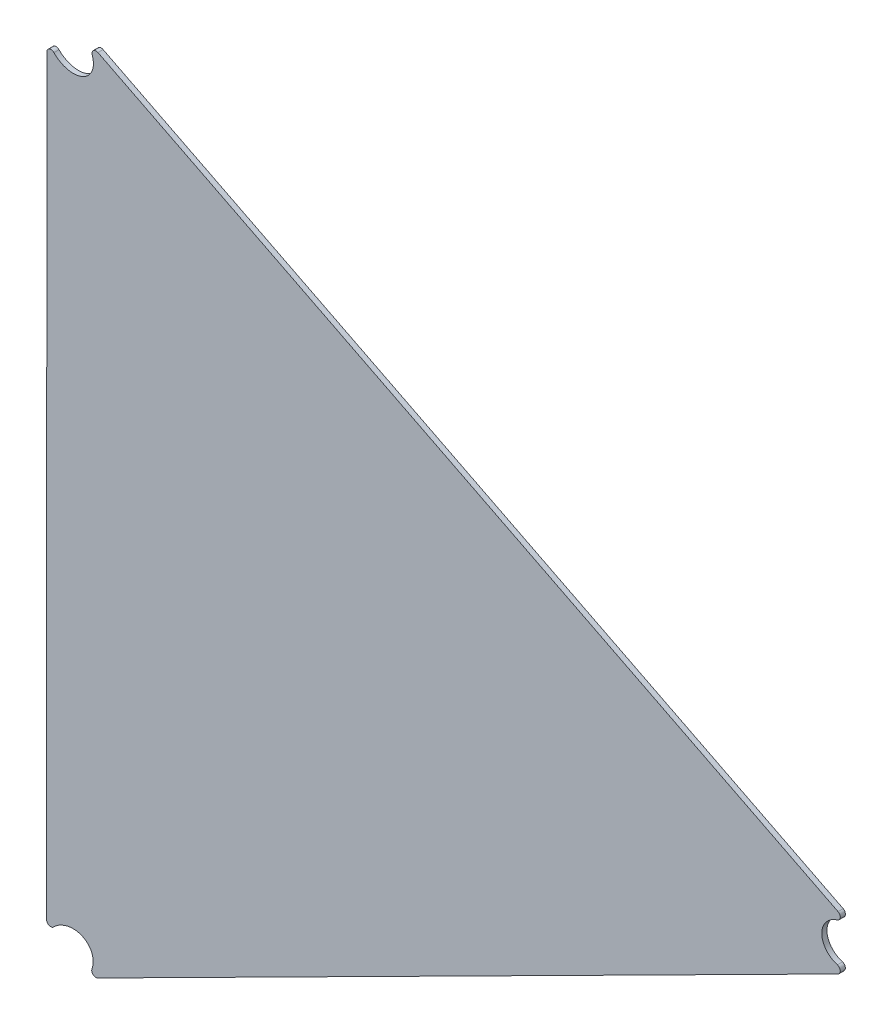
ISO-10303-21;
HEADER;
FILE_DESCRIPTION(('STEP AP214'),'2;1');
FILE_NAME('part.step','',(''),(''),'','','');
FILE_SCHEMA(('AUTOMOTIVE_DESIGN { 1 0 10303 214 1 1 1 1 }'));
ENDSEC;
DATA;
#1=APPLICATION_CONTEXT('core data for automotive mechanical design processes');
#2=APPLICATION_PROTOCOL_DEFINITION('international standard','automotive_design',2000,#1);
#3=PRODUCT_CONTEXT('',#1,'mechanical');
#4=PRODUCT('Part','Part','',(#3));
#5=PRODUCT_RELATED_PRODUCT_CATEGORY('part','',(#4));
#6=PRODUCT_DEFINITION_FORMATION('','',#4);
#7=PRODUCT_DEFINITION_CONTEXT('part definition',#1,'design');
#8=PRODUCT_DEFINITION('design','',#6,#7);
#9=PRODUCT_DEFINITION_SHAPE('','',#8);
#10=(LENGTH_UNIT() NAMED_UNIT(*) SI_UNIT(.MILLI.,.METRE.));
#11=(NAMED_UNIT(*) PLANE_ANGLE_UNIT() SI_UNIT($,.RADIAN.));
#12=(NAMED_UNIT(*) SI_UNIT($,.STERADIAN.) SOLID_ANGLE_UNIT());
#13=UNCERTAINTY_MEASURE_WITH_UNIT(LENGTH_MEASURE(1.E-05),#10,'distance_accuracy_value','');
#14=(GEOMETRIC_REPRESENTATION_CONTEXT(3) GLOBAL_UNCERTAINTY_ASSIGNED_CONTEXT((#13)) GLOBAL_UNIT_ASSIGNED_CONTEXT((#10,
#11,#12)) REPRESENTATION_CONTEXT('',''));
#15=CARTESIAN_POINT('',(0.,0.,0.));
#16=DIRECTION('',(0.,0.,1.));
#17=DIRECTION('',(1.,0.,0.));
#18=AXIS2_PLACEMENT_3D('',#15,#16,#17);
#19=CARTESIAN_POINT('',(58.7659431933585,116.31081468342,3.175));
#20=DIRECTION('',(0.450957770189797,0.89254528708937,0.));
#21=DIRECTION('',(-0.89254528708937,0.450957770189797,0.));
#22=AXIS2_PLACEMENT_3D('',#19,#20,#21);
#23=PLANE('',#22);
#24=DIRECTION('',(0.89254528708937,-0.450957770189797,0.));
#25=VECTOR('',#24,1.);
#26=CARTESIAN_POINT('',(58.7659431933585,116.31081468342,0.));
#27=LINE('',#26,#25);
#28=CARTESIAN_POINT('',(-216.125289866631,255.199383474937,0.));
#29=VERTEX_POINT('',#28);
#30=CARTESIAN_POINT('',(241.670605569378,23.898384865561,0.));
#31=VERTEX_POINT('',#30);
#32=EDGE_CURVE('E167',#29,#31,#27,.T.);
#33=ORIENTED_EDGE('',*,*,#32,.F.);
#34=DIRECTION('',(0.,0.,1.));
#35=VECTOR('',#34,1.);
#36=CARTESIAN_POINT('',(-216.125289866631,255.199383474937,3.175));
#37=LINE('',#36,#35);
#38=CARTESIAN_POINT('',(-216.125289866631,255.199383474937,3.175));
#39=VERTEX_POINT('',#38);
#40=EDGE_CURVE('E214',#29,#39,#37,.T.);
#41=ORIENTED_EDGE('',*,*,#40,.T.);
#42=DIRECTION('',(0.89254528708937,-0.450957770189797,0.));
#43=VECTOR('',#42,1.);
#44=CARTESIAN_POINT('',(58.7659431933585,116.31081468342,3.175));
#45=LINE('',#44,#43);
#46=CARTESIAN_POINT('',(241.670605569378,23.898384865561,3.175));
#47=VERTEX_POINT('',#46);
#48=EDGE_CURVE('E184',#39,#47,#45,.T.);
#49=ORIENTED_EDGE('',*,*,#48,.T.);
#50=DIRECTION('',(0.,0.,1.));
#51=VECTOR('',#50,1.);
#52=CARTESIAN_POINT('',(241.670605569378,23.8983848655609,0.));
#53=LINE('',#52,#51);
#54=EDGE_CURVE('E211',#47,#31,#53,.F.);
#55=ORIENTED_EDGE('',*,*,#54,.T.);
#56=EDGE_LOOP('',(#33,#41,#49,#55));
#57=FACE_BOUND('',#56,.T.);
#58=ADVANCED_FACE('F44',(#57),#23,.T.);
#59=CARTESIAN_POINT('',(-220.367085382762,242.285684548812,3.175));
#60=CARTESIAN_POINT('',(-232.922317899601,220.205690516927,3.175));
#61=CARTESIAN_POINT('',(-258.843580849406,234.945163860758,3.175));
#62=CARTESIAN_POINT('',(-246.288348332567,257.025157892643,3.175));
#63=CARTESIAN_POINT('',(-233.733115815727,279.105151924529,3.175));
#64=CARTESIAN_POINT('',(-207.811852865923,264.365678580698,3.175));
#65=CARTESIAN_POINT('',(-220.367085382762,242.285684548812,3.175));
#66=(BOUNDED_CURVE() B_SPLINE_CURVE(3,(#59,#60,#61,#62,#63,#64,#65),.UNSPECIFIED.,.T.,
.F.) B_SPLINE_CURVE_WITH_KNOTS((4,3,4),(0.,0.5,1.),
.UNSPECIFIED.) CURVE() GEOMETRIC_REPRESENTATION_ITEM() RATIONAL_B_SPLINE_CURVE((1.,
0.333333333333333,0.333333333333333,1.,0.333333333333333,0.333333333333333,1.)) REPRESENTATION_ITEM(''));
#67=DIRECTION('',(0.,0.,-1.));
#68=VECTOR('',#67,1.);
#69=SURFACE_OF_LINEAR_EXTRUSION('',#66,#68);
#70=CARTESIAN_POINT('',(-220.367085382762,242.285684548812,0.));
#71=CARTESIAN_POINT('',(-232.922317899601,220.205690516927,0.));
#72=CARTESIAN_POINT('',(-258.843580849406,234.945163860758,0.));
#73=CARTESIAN_POINT('',(-246.288348332567,257.025157892643,0.));
#74=CARTESIAN_POINT('',(-233.733115815727,279.105151924529,0.));
#75=CARTESIAN_POINT('',(-207.811852865923,264.365678580698,0.));
#76=CARTESIAN_POINT('',(-220.367085382762,242.285684548812,0.));
#77=(BOUNDED_CURVE() B_SPLINE_CURVE(3,(#70,#71,#72,#73,#74,#75,#76),.UNSPECIFIED.,.T.,
.F.) B_SPLINE_CURVE_WITH_KNOTS((4,3,4),(0.,0.5,1.),
.UNSPECIFIED.) CURVE() GEOMETRIC_REPRESENTATION_ITEM() RATIONAL_B_SPLINE_CURVE((1.,
0.333333333333333,0.333333333333333,1.,0.333333333333333,0.333333333333333,1.)) REPRESENTATION_ITEM(''));
#78=CARTESIAN_POINT('',(-219.668408896516,252.094046152578,0.));
#79=VERTEX_POINT('',#78);
#80=CARTESIAN_POINT('',(-243.381643144723,241.512419940637,0.));
#81=VERTEX_POINT('',#80);
#82=EDGE_CURVE('E162',#79,#81,#77,.T.);
#83=ORIENTED_EDGE('',*,*,#82,.T.);
#84=DIRECTION('',(0.,0.,-1.));
#85=VECTOR('',#84,1.);
#86=CARTESIAN_POINT('',(-243.381643144723,241.512419940637,0.));
#87=LINE('',#86,#85);
#88=CARTESIAN_POINT('',(-243.381643144723,241.512419940637,3.175));
#89=VERTEX_POINT('',#88);
#90=EDGE_CURVE('E139',#81,#89,#87,.F.);
#91=ORIENTED_EDGE('',*,*,#90,.T.);
#92=CARTESIAN_POINT('',(-219.668408896516,252.094046152578,3.175));
#93=VERTEX_POINT('',#92);
#94=EDGE_CURVE('E278',#93,#89,#66,.T.);
#95=ORIENTED_EDGE('',*,*,#94,.F.);
#96=DIRECTION('',(0.,0.,-1.));
#97=VECTOR('',#96,1.);
#98=CARTESIAN_POINT('',(-219.668408896516,252.094046152578,3.175));
#99=LINE('',#98,#97);
#100=EDGE_CURVE('E144',#93,#79,#99,.T.);
#101=ORIENTED_EDGE('',*,*,#100,.T.);
#102=EDGE_LOOP('',(#83,#91,#95,#101));
#103=FACE_BOUND('',#102,.T.);
#104=ADVANCED_FACE('F286',(#103),#69,.F.);
#105=CARTESIAN_POINT('',(-247.811547389579,0.0817305887019815,3.175));
#106=DIRECTION('',(0.99999994561287,-0.000329809426226626,0.));
#107=DIRECTION('',(0.000329809426226626,0.99999994561287,0.));
#108=AXIS2_PLACEMENT_3D('',#105,#106,#107);
#109=PLANE('',#108);
#110=DIRECTION('',(-0.000329809426226626,-0.99999994561287,0.));
#111=VECTOR('',#110,1.);
#112=CARTESIAN_POINT('',(-247.811547389579,0.0817305887019815,3.175));
#113=LINE('',#112,#111);
#114=CARTESIAN_POINT('',(-247.732508419993,239.732143832451,3.175));
#115=VERTEX_POINT('',#114);
#116=CARTESIAN_POINT('',(-247.885839538062,-225.176065382714,3.175));
#117=VERTEX_POINT('',#116);
#118=EDGE_CURVE('E154',#115,#117,#113,.T.);
#119=ORIENTED_EDGE('',*,*,#118,.F.);
#120=DIRECTION('',(0.,0.,-1.));
#121=VECTOR('',#120,1.);
#122=CARTESIAN_POINT('',(-247.732508419993,239.732143832451,3.175));
#123=LINE('',#122,#121);
#124=CARTESIAN_POINT('',(-247.732508419993,239.732143832451,0.));
#125=VERTEX_POINT('',#124);
#126=EDGE_CURVE('E138',#115,#125,#123,.T.);
#127=ORIENTED_EDGE('',*,*,#126,.T.);
#128=DIRECTION('',(-0.000329809426226626,-0.99999994561287,0.));
#129=VECTOR('',#128,1.);
#130=CARTESIAN_POINT('',(-247.811547389579,0.0817305887019815,0.));
#131=LINE('',#130,#129);
#132=CARTESIAN_POINT('',(-247.885839538062,-225.176065382714,0.));
#133=VERTEX_POINT('',#132);
#134=EDGE_CURVE('E151',#125,#133,#131,.T.);
#135=ORIENTED_EDGE('',*,*,#134,.T.);
#136=DIRECTION('',(0.,0.,-1.));
#137=VECTOR('',#136,1.);
#138=CARTESIAN_POINT('',(-247.885839538062,-225.176065382713,3.175));
#139=LINE('',#138,#137);
#140=EDGE_CURVE('E156',#133,#117,#139,.F.);
#141=ORIENTED_EDGE('',*,*,#140,.T.);
#142=EDGE_LOOP('',(#119,#127,#135,#141));
#143=FACE_BOUND('',#142,.T.);
#144=ADVANCED_FACE('F150',(#143),#109,.F.);
#145=CARTESIAN_POINT('',(-220.525871765348,-227.74584753326,3.175));
#146=CARTESIAN_POINT('',(-207.980114588808,-249.831226788942,3.175));
#147=CARTESIAN_POINT('',(-233.905964880208,-264.558590923635,3.175));
#148=CARTESIAN_POINT('',(-246.451722056748,-242.473211667953,3.175));
#149=CARTESIAN_POINT('',(-258.997479233288,-220.387832412272,3.175));
#150=CARTESIAN_POINT('',(-233.071628941887,-205.660468277578,3.175));
#151=CARTESIAN_POINT('',(-220.525871765348,-227.74584753326,3.175));
#152=(BOUNDED_CURVE() B_SPLINE_CURVE(3,(#145,#146,#147,#148,#149,#150,#151),.UNSPECIFIED.,.T.,
.F.) B_SPLINE_CURVE_WITH_KNOTS((4,3,4),(0.,0.5,1.),
.UNSPECIFIED.) CURVE() GEOMETRIC_REPRESENTATION_ITEM() RATIONAL_B_SPLINE_CURVE((1.,
0.333333333333333,0.333333333333333,1.,0.333333333333333,0.333333333333333,1.)) REPRESENTATION_ITEM(''));
#153=DIRECTION('',(0.,0.,-1.));
#154=VECTOR('',#153,1.);
#155=SURFACE_OF_LINEAR_EXTRUSION('',#152,#154);
#156=CARTESIAN_POINT('',(-220.525871765348,-227.74584753326,0.));
#157=CARTESIAN_POINT('',(-207.980114588808,-249.831226788942,0.));
#158=CARTESIAN_POINT('',(-233.905964880208,-264.558590923635,0.));
#159=CARTESIAN_POINT('',(-246.451722056748,-242.473211667953,0.));
#160=CARTESIAN_POINT('',(-258.997479233288,-220.387832412272,0.));
#161=CARTESIAN_POINT('',(-233.071628941887,-205.660468277578,0.));
#162=CARTESIAN_POINT('',(-220.525871765348,-227.74584753326,0.));
#163=(BOUNDED_CURVE() B_SPLINE_CURVE(3,(#156,#157,#158,#159,#160,#161,#162),.UNSPECIFIED.,.T.,
.F.) B_SPLINE_CURVE_WITH_KNOTS((4,3,4),(0.,0.5,1.),
.UNSPECIFIED.) CURVE() GEOMETRIC_REPRESENTATION_ITEM() RATIONAL_B_SPLINE_CURVE((1.,
0.333333333333333,0.333333333333333,1.,0.333333333333333,0.333333333333333,1.)) REPRESENTATION_ITEM(''));
#164=CARTESIAN_POINT('',(-243.536134041832,-226.95919530728,0.));
#165=VERTEX_POINT('',#164);
#166=CARTESIAN_POINT('',(-219.831184056302,-237.554444482021,0.));
#167=VERTEX_POINT('',#166);
#168=EDGE_CURVE('E161',#165,#167,#163,.T.);
#169=ORIENTED_EDGE('',*,*,#168,.T.);
#170=DIRECTION('',(0.,0.,-1.));
#171=VECTOR('',#170,1.);
#172=CARTESIAN_POINT('',(-219.831184056302,-237.554444482021,0.));
#173=LINE('',#172,#171);
#174=CARTESIAN_POINT('',(-219.831184056302,-237.554444482021,3.175));
#175=VERTEX_POINT('',#174);
#176=EDGE_CURVE('E224',#167,#175,#173,.F.);
#177=ORIENTED_EDGE('',*,*,#176,.T.);
#178=CARTESIAN_POINT('',(-243.536134041832,-226.95919530728,3.175));
#179=VERTEX_POINT('',#178);
#180=EDGE_CURVE('E230',#179,#175,#152,.T.);
#181=ORIENTED_EDGE('',*,*,#180,.F.);
#182=DIRECTION('',(0.,0.,-1.));
#183=VECTOR('',#182,1.);
#184=CARTESIAN_POINT('',(-243.536134041832,-226.95919530728,3.175));
#185=LINE('',#184,#183);
#186=EDGE_CURVE('E221',#179,#165,#185,.T.);
#187=ORIENTED_EDGE('',*,*,#186,.T.);
#188=EDGE_LOOP('',(#169,#177,#181,#187));
#189=FACE_BOUND('',#188,.T.);
#190=ADVANCED_FACE('F229',(#189),#155,.F.);
#191=CARTESIAN_POINT('',(52.8944621775781,-104.80247024521,3.175));
#192=DIRECTION('',(-0.450571607871069,0.892740290443127,0.));
#193=DIRECTION('',(-0.892740290443127,-0.45057160787107,0.));
#194=AXIS2_PLACEMENT_3D('',#191,#192,#193);
#195=PLANE('',#194);
#196=DIRECTION('',(0.892740290443127,0.45057160787107,0.));
#197=VECTOR('',#196,1.);
#198=CARTESIAN_POINT('',(52.8944621775781,-104.80247024521,3.175));
#199=LINE('',#198,#197);
#200=CARTESIAN_POINT('',(-216.289382854834,-240.661240334961,3.175));
#201=VERTEX_POINT('',#200);
#202=CARTESIAN_POINT('',(241.661178158875,-9.53072812408658,3.175));
#203=VERTEX_POINT('',#202);
#204=EDGE_CURVE('E238',#201,#203,#199,.T.);
#205=ORIENTED_EDGE('',*,*,#204,.F.);
#206=DIRECTION('',(0.,0.,-1.));
#207=VECTOR('',#206,1.);
#208=CARTESIAN_POINT('',(-216.289382854834,-240.661240334961,3.175));
#209=LINE('',#208,#207);
#210=CARTESIAN_POINT('',(-216.289382854834,-240.661240334961,0.));
#211=VERTEX_POINT('',#210);
#212=EDGE_CURVE('E218',#201,#211,#209,.T.);
#213=ORIENTED_EDGE('',*,*,#212,.T.);
#214=DIRECTION('',(0.892740290443127,0.45057160787107,0.));
#215=VECTOR('',#214,1.);
#216=CARTESIAN_POINT('',(52.8944621775781,-104.80247024521,0.));
#217=LINE('',#216,#215);
#218=CARTESIAN_POINT('',(241.661178158875,-9.53072812408658,0.));
#219=VERTEX_POINT('',#218);
#220=EDGE_CURVE('E165',#211,#219,#217,.T.);
#221=ORIENTED_EDGE('',*,*,#220,.T.);
#222=DIRECTION('',(0.,0.,-1.));
#223=VECTOR('',#222,1.);
#224=CARTESIAN_POINT('',(241.661178158875,-9.53072812408656,3.175));
#225=LINE('',#224,#223);
#226=EDGE_CURVE('E216',#219,#203,#225,.F.);
#227=ORIENTED_EDGE('',*,*,#226,.T.);
#228=EDGE_LOOP('',(#205,#213,#221,#227));
#229=FACE_BOUND('',#228,.T.);
#230=ADVANCED_FACE('F244',(#229),#195,.F.);
#231=CARTESIAN_POINT('',(231.62836628154,7.18068180978798,3.175));
#232=CARTESIAN_POINT('',(231.624341795559,32.5806814909595,3.175));
#233=CARTESIAN_POINT('',(260.098831127633,32.5851931123994,3.175));
#234=CARTESIAN_POINT('',(260.102855613614,7.18519343122789,3.175));
#235=CARTESIAN_POINT('',(260.106880099595,-18.2148062499436,3.175));
#236=CARTESIAN_POINT('',(231.632390767521,-18.2193178713835,3.175));
#237=CARTESIAN_POINT('',(231.62836628154,7.18068180978798,3.175));
#238=(BOUNDED_CURVE() B_SPLINE_CURVE(3,(#231,#232,#233,#234,#235,#236,#237),.UNSPECIFIED.,.T.,
.F.) B_SPLINE_CURVE_WITH_KNOTS((4,3,4),(0.,0.5,1.),
.UNSPECIFIED.) CURVE() GEOMETRIC_REPRESENTATION_ITEM() RATIONAL_B_SPLINE_CURVE((1.,
0.333333333333333,0.333333333333333,1.,0.333333333333333,0.333333333333333,1.)) REPRESENTATION_ITEM(''));
#239=DIRECTION('',(0.,0.,-1.));
#240=VECTOR('',#239,1.);
#241=SURFACE_OF_LINEAR_EXTRUSION('',#238,#240);
#242=CARTESIAN_POINT('',(241.257907960389,-4.83371317491654,3.175));
#243=VERTEX_POINT('',#242);
#244=CARTESIAN_POINT('',(241.265285670844,19.2015393961907,3.175));
#245=VERTEX_POINT('',#244);
#246=EDGE_CURVE('E188',#243,#245,#238,.T.);
#247=ORIENTED_EDGE('',*,*,#246,.F.);
#248=DIRECTION('',(0.,0.,-1.));
#249=VECTOR('',#248,1.);
#250=CARTESIAN_POINT('',(241.257907960378,-4.83371317491324,3.175));
#251=LINE('',#250,#249);
#252=CARTESIAN_POINT('',(241.257907960378,-4.83371317491323,0.));
#253=VERTEX_POINT('',#252);
#254=EDGE_CURVE('E11',#243,#253,#251,.T.);
#255=ORIENTED_EDGE('',*,*,#254,.T.);
#256=CARTESIAN_POINT('',(231.62836628154,7.18068180978798,0.));
#257=CARTESIAN_POINT('',(231.624341795559,32.5806814909595,0.));
#258=CARTESIAN_POINT('',(260.098831127633,32.5851931123994,0.));
#259=CARTESIAN_POINT('',(260.102855613614,7.18519343122789,0.));
#260=CARTESIAN_POINT('',(260.106880099595,-18.2148062499436,0.));
#261=CARTESIAN_POINT('',(231.632390767521,-18.2193178713835,0.));
#262=CARTESIAN_POINT('',(231.62836628154,7.18068180978798,0.));
#263=(BOUNDED_CURVE() B_SPLINE_CURVE(3,(#256,#257,#258,#259,#260,#261,#262),.UNSPECIFIED.,.T.,
.F.) B_SPLINE_CURVE_WITH_KNOTS((4,3,4),(0.,0.5,1.),
.UNSPECIFIED.) CURVE() GEOMETRIC_REPRESENTATION_ITEM() RATIONAL_B_SPLINE_CURVE((1.,
0.333333333333333,0.333333333333333,1.,0.333333333333333,0.333333333333333,1.)) REPRESENTATION_ITEM(''));
#264=CARTESIAN_POINT('',(241.265285670844,19.2015393961908,0.));
#265=VERTEX_POINT('',#264);
#266=EDGE_CURVE('E180',#253,#265,#263,.T.);
#267=ORIENTED_EDGE('',*,*,#266,.T.);
#268=DIRECTION('',(0.,0.,-1.));
#269=VECTOR('',#268,1.);
#270=CARTESIAN_POINT('',(241.265285670844,19.2015393961908,0.));
#271=LINE('',#270,#269);
#272=EDGE_CURVE('E52',#265,#245,#271,.F.);
#273=ORIENTED_EDGE('',*,*,#272,.T.);
#274=EDGE_LOOP('',(#247,#255,#267,#273));
#275=FACE_BOUND('',#274,.T.);
#276=ADVANCED_FACE('F250',(#275),#241,.F.);
#277=CARTESIAN_POINT('',(0.,0.,3.175));
#278=DIRECTION('',(0.,0.,1.));
#279=DIRECTION('',(1.,0.,0.));
#280=AXIS2_PLACEMENT_3D('',#277,#278,#279);
#281=PLANE('',#280);
#282=ORIENTED_EDGE('',*,*,#94,.T.);
#283=CARTESIAN_POINT('',(-245.192508558136,239.731306116508,3.175));
#284=DIRECTION('',(0.,0.,1.));
#285=DIRECTION('',(1.,0.,0.));
#286=AXIS2_PLACEMENT_3D('',#283,#284,#285);
#287=CIRCLE('',#286,2.54);
#288=EDGE_CURVE('E209',#89,#115,#287,.T.);
#289=ORIENTED_EDGE('',*,*,#288,.T.);
#290=ORIENTED_EDGE('',*,*,#118,.T.);
#291=CARTESIAN_POINT('',(-245.345839676205,-225.176903098656,3.175));
#292=DIRECTION('',(0.,0.,1.));
#293=DIRECTION('',(1.,0.,0.));
#294=AXIS2_PLACEMENT_3D('',#291,#292,#293);
#295=CIRCLE('',#294,2.54);
#296=EDGE_CURVE('E203',#117,#179,#295,.T.);
#297=ORIENTED_EDGE('',*,*,#296,.T.);
#298=ORIENTED_EDGE('',*,*,#180,.T.);
#299=CARTESIAN_POINT('',(-217.433834738826,-238.393679997236,3.175));
#300=DIRECTION('',(0.,0.,1.));
#301=DIRECTION('',(1.,0.,0.));
#302=AXIS2_PLACEMENT_3D('',#299,#300,#301);
#303=CIRCLE('',#302,2.54);
#304=EDGE_CURVE('E205',#175,#201,#303,.T.);
#305=ORIENTED_EDGE('',*,*,#304,.T.);
#306=ORIENTED_EDGE('',*,*,#204,.T.);
#307=CARTESIAN_POINT('',(240.516726274882,-7.26316778636106,3.175));
#308=DIRECTION('',(0.,0.,1.));
#309=DIRECTION('',(1.,0.,0.));
#310=AXIS2_PLACEMENT_3D('',#307,#308,#309);
#311=CIRCLE('',#310,2.54);
#312=EDGE_CURVE('E65',#203,#243,#311,.T.);
#313=ORIENTED_EDGE('',*,*,#312,.T.);
#314=ORIENTED_EDGE('',*,*,#246,.T.);
#315=CARTESIAN_POINT('',(240.525172833096,21.631319836354,3.175));
#316=DIRECTION('',(0.,0.,1.));
#317=DIRECTION('',(1.,0.,0.));
#318=AXIS2_PLACEMENT_3D('',#315,#316,#317);
#319=CIRCLE('',#318,2.54);
#320=EDGE_CURVE('E200',#245,#47,#319,.T.);
#321=ORIENTED_EDGE('',*,*,#320,.T.);
#322=ORIENTED_EDGE('',*,*,#48,.F.);
#323=CARTESIAN_POINT('',(-217.270722602913,252.93231844573,3.175));
#324=DIRECTION('',(0.,0.,1.));
#325=DIRECTION('',(1.,0.,0.));
#326=AXIS2_PLACEMENT_3D('',#323,#324,#325);
#327=CIRCLE('',#326,2.54);
#328=EDGE_CURVE('E207',#39,#93,#327,.T.);
#329=ORIENTED_EDGE('',*,*,#328,.T.);
#330=EDGE_LOOP('',(#282,#289,#290,#297,#298,#305,#306,#313,#314,#321,#322,#329));
#331=FACE_BOUND('',#330,.T.);
#332=ADVANCED_FACE('F235',(#331),#281,.T.);
#333=CARTESIAN_POINT('',(0.,0.,0.));
#334=DIRECTION('',(0.,0.,1.));
#335=DIRECTION('',(1.,0.,0.));
#336=AXIS2_PLACEMENT_3D('',#333,#334,#335);
#337=PLANE('',#336);
#338=ORIENTED_EDGE('',*,*,#134,.F.);
#339=CARTESIAN_POINT('',(-245.192508558136,239.731306116508,0.));
#340=DIRECTION('',(0.,0.,1.));
#341=DIRECTION('',(1.,0.,0.));
#342=AXIS2_PLACEMENT_3D('',#339,#340,#341);
#343=CIRCLE('',#342,2.54);
#344=EDGE_CURVE('E134',#125,#81,#343,.F.);
#345=ORIENTED_EDGE('',*,*,#344,.T.);
#346=ORIENTED_EDGE('',*,*,#82,.F.);
#347=CARTESIAN_POINT('',(-217.270722602913,252.93231844573,0.));
#348=DIRECTION('',(0.,0.,1.));
#349=DIRECTION('',(1.,0.,0.));
#350=AXIS2_PLACEMENT_3D('',#347,#348,#349);
#351=CIRCLE('',#350,2.54);
#352=EDGE_CURVE('E145',#79,#29,#351,.F.);
#353=ORIENTED_EDGE('',*,*,#352,.T.);
#354=ORIENTED_EDGE('',*,*,#32,.T.);
#355=CARTESIAN_POINT('',(240.525172833096,21.631319836354,0.));
#356=DIRECTION('',(0.,0.,1.));
#357=DIRECTION('',(1.,0.,0.));
#358=AXIS2_PLACEMENT_3D('',#355,#356,#357);
#359=CIRCLE('',#358,2.54);
#360=EDGE_CURVE('E155',#31,#265,#359,.F.);
#361=ORIENTED_EDGE('',*,*,#360,.T.);
#362=ORIENTED_EDGE('',*,*,#266,.F.);
#363=CARTESIAN_POINT('',(240.516726274882,-7.26316778636106,0.));
#364=DIRECTION('',(0.,0.,1.));
#365=DIRECTION('',(1.,0.,0.));
#366=AXIS2_PLACEMENT_3D('',#363,#364,#365);
#367=CIRCLE('',#366,2.54);
#368=EDGE_CURVE('E191',#253,#219,#367,.F.);
#369=ORIENTED_EDGE('',*,*,#368,.T.);
#370=ORIENTED_EDGE('',*,*,#220,.F.);
#371=CARTESIAN_POINT('',(-217.433834738826,-238.393679997236,0.));
#372=DIRECTION('',(0.,0.,1.));
#373=DIRECTION('',(1.,0.,0.));
#374=AXIS2_PLACEMENT_3D('',#371,#372,#373);
#375=CIRCLE('',#374,2.54);
#376=EDGE_CURVE('E194',#211,#167,#375,.F.);
#377=ORIENTED_EDGE('',*,*,#376,.T.);
#378=ORIENTED_EDGE('',*,*,#168,.F.);
#379=CARTESIAN_POINT('',(-245.345839676205,-225.176903098656,0.));
#380=DIRECTION('',(0.,0.,1.));
#381=DIRECTION('',(1.,0.,0.));
#382=AXIS2_PLACEMENT_3D('',#379,#380,#381);
#383=CIRCLE('',#382,2.54);
#384=EDGE_CURVE('E160',#165,#133,#383,.F.);
#385=ORIENTED_EDGE('',*,*,#384,.T.);
#386=EDGE_LOOP('',(#338,#345,#346,#353,#354,#361,#362,#369,#370,#377,#378,#385));
#387=FACE_BOUND('',#386,.T.);
#388=ADVANCED_FACE('F158',(#387),#337,.F.);
#389=CARTESIAN_POINT('',(-245.192508558136,239.731306116508,1.5875));
#390=DIRECTION('',(0.,0.,-1.));
#391=DIRECTION('',(-1.,0.,0.));
#392=AXIS2_PLACEMENT_3D('',#389,#390,#391);
#393=CYLINDRICAL_SURFACE('',#392,2.54);
#394=ORIENTED_EDGE('',*,*,#288,.F.);
#395=ORIENTED_EDGE('',*,*,#90,.F.);
#396=ORIENTED_EDGE('',*,*,#344,.F.);
#397=ORIENTED_EDGE('',*,*,#126,.F.);
#398=EDGE_LOOP('',(#394,#395,#396,#397));
#399=FACE_BOUND('',#398,.T.);
#400=ADVANCED_FACE('F137',(#399),#393,.T.);
#401=CARTESIAN_POINT('',(-217.270722602913,252.93231844573,1.5875));
#402=DIRECTION('',(0.,0.,-1.));
#403=DIRECTION('',(-1.,0.,0.));
#404=AXIS2_PLACEMENT_3D('',#401,#402,#403);
#405=CYLINDRICAL_SURFACE('',#404,2.54);
#406=ORIENTED_EDGE('',*,*,#328,.F.);
#407=ORIENTED_EDGE('',*,*,#40,.F.);
#408=ORIENTED_EDGE('',*,*,#352,.F.);
#409=ORIENTED_EDGE('',*,*,#100,.F.);
#410=EDGE_LOOP('',(#406,#407,#408,#409));
#411=FACE_BOUND('',#410,.T.);
#412=ADVANCED_FACE('F295',(#411),#405,.T.);
#413=CARTESIAN_POINT('',(-217.433834738826,-238.393679997236,1.5875));
#414=DIRECTION('',(0.,0.,-1.));
#415=DIRECTION('',(-1.,0.,0.));
#416=AXIS2_PLACEMENT_3D('',#413,#414,#415);
#417=CYLINDRICAL_SURFACE('',#416,2.54);
#418=ORIENTED_EDGE('',*,*,#304,.F.);
#419=ORIENTED_EDGE('',*,*,#176,.F.);
#420=ORIENTED_EDGE('',*,*,#376,.F.);
#421=ORIENTED_EDGE('',*,*,#212,.F.);
#422=EDGE_LOOP('',(#418,#419,#420,#421));
#423=FACE_BOUND('',#422,.T.);
#424=ADVANCED_FACE('F241',(#423),#417,.T.);
#425=CARTESIAN_POINT('',(-245.345839676205,-225.176903098656,1.5875));
#426=DIRECTION('',(0.,0.,-1.));
#427=DIRECTION('',(-1.,0.,0.));
#428=AXIS2_PLACEMENT_3D('',#425,#426,#427);
#429=CYLINDRICAL_SURFACE('',#428,2.54);
#430=ORIENTED_EDGE('',*,*,#296,.F.);
#431=ORIENTED_EDGE('',*,*,#140,.F.);
#432=ORIENTED_EDGE('',*,*,#384,.F.);
#433=ORIENTED_EDGE('',*,*,#186,.F.);
#434=EDGE_LOOP('',(#430,#431,#432,#433));
#435=FACE_BOUND('',#434,.T.);
#436=ADVANCED_FACE('F301',(#435),#429,.T.);
#437=CARTESIAN_POINT('',(240.516726274882,-7.26316778636106,1.5875));
#438=DIRECTION('',(0.,0.,-1.));
#439=DIRECTION('',(-1.,0.,0.));
#440=AXIS2_PLACEMENT_3D('',#437,#438,#439);
#441=CYLINDRICAL_SURFACE('',#440,2.54);
#442=ORIENTED_EDGE('',*,*,#312,.F.);
#443=ORIENTED_EDGE('',*,*,#226,.F.);
#444=ORIENTED_EDGE('',*,*,#368,.F.);
#445=ORIENTED_EDGE('',*,*,#254,.F.);
#446=EDGE_LOOP('',(#442,#443,#444,#445));
#447=FACE_BOUND('',#446,.T.);
#448=ADVANCED_FACE('F249',(#447),#441,.T.);
#449=CARTESIAN_POINT('',(240.525172833096,21.631319836354,1.5875));
#450=DIRECTION('',(0.,0.,-1.));
#451=DIRECTION('',(-1.,0.,0.));
#452=AXIS2_PLACEMENT_3D('',#449,#450,#451);
#453=CYLINDRICAL_SURFACE('',#452,2.54);
#454=ORIENTED_EDGE('',*,*,#320,.F.);
#455=ORIENTED_EDGE('',*,*,#272,.F.);
#456=ORIENTED_EDGE('',*,*,#360,.F.);
#457=ORIENTED_EDGE('',*,*,#54,.F.);
#458=EDGE_LOOP('',(#454,#455,#456,#457));
#459=FACE_BOUND('',#458,.T.);
#460=ADVANCED_FACE('F46',(#459),#453,.T.);
#461=CLOSED_SHELL('',(#58,#104,#144,#190,#230,#276,#332,#388,#400,#412,#424,#436,#448,#460));
#462=MANIFOLD_SOLID_BREP('B2',#461);
#463=ADVANCED_BREP_SHAPE_REPRESENTATION('',(#18,#462),#14);
#464=SHAPE_DEFINITION_REPRESENTATION(#9,#463);
ENDSEC;
END-ISO-10303-21;
